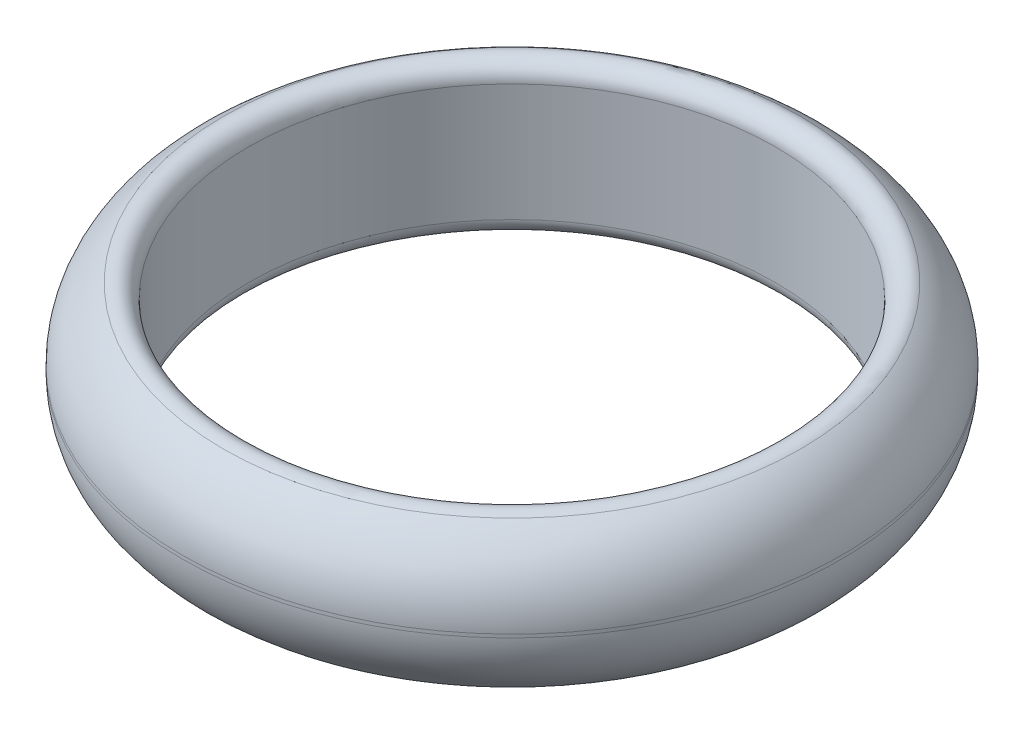
ISO-10303-21;
HEADER;
FILE_DESCRIPTION(('STEP AP214'),'2;1');
FILE_NAME('part.step','',(''),(''),'','','');
FILE_SCHEMA(('AUTOMOTIVE_DESIGN { 1 0 10303 214 1 1 1 1 }'));
ENDSEC;
DATA;
#1=APPLICATION_CONTEXT('core data for automotive mechanical design processes');
#2=APPLICATION_PROTOCOL_DEFINITION('international standard','automotive_design',2000,#1);
#3=PRODUCT_CONTEXT('',#1,'mechanical');
#4=PRODUCT('Part','Part','',(#3));
#5=PRODUCT_RELATED_PRODUCT_CATEGORY('part','',(#4));
#6=PRODUCT_DEFINITION_FORMATION('','',#4);
#7=PRODUCT_DEFINITION_CONTEXT('part definition',#1,'design');
#8=PRODUCT_DEFINITION('design','',#6,#7);
#9=PRODUCT_DEFINITION_SHAPE('','',#8);
#10=(LENGTH_UNIT() NAMED_UNIT(*) SI_UNIT(.MILLI.,.METRE.));
#11=(NAMED_UNIT(*) PLANE_ANGLE_UNIT() SI_UNIT($,.RADIAN.));
#12=(NAMED_UNIT(*) SI_UNIT($,.STERADIAN.) SOLID_ANGLE_UNIT());
#13=UNCERTAINTY_MEASURE_WITH_UNIT(LENGTH_MEASURE(1.E-05),#10,'distance_accuracy_value','');
#14=(GEOMETRIC_REPRESENTATION_CONTEXT(3) GLOBAL_UNCERTAINTY_ASSIGNED_CONTEXT((#13)) GLOBAL_UNIT_ASSIGNED_CONTEXT((#10,
#11,#12)) REPRESENTATION_CONTEXT('',''));
#15=CARTESIAN_POINT('',(0.,0.,0.));
#16=DIRECTION('',(0.,0.,1.));
#17=DIRECTION('',(1.,0.,0.));
#18=AXIS2_PLACEMENT_3D('',#15,#16,#17);
#19=CARTESIAN_POINT('',(0.,5.,0.));
#20=DIRECTION('',(0.,-1.,0.));
#21=DIRECTION('',(0.,0.,-1.));
#22=AXIS2_PLACEMENT_3D('',#19,#20,#21);
#23=CYLINDRICAL_SURFACE('',#22,10.);
#24=CARTESIAN_POINT('',(0.,2.44948974278318,0.));
#25=DIRECTION('',(0.,-1.,0.));
#26=DIRECTION('',(0.,0.,-1.));
#27=AXIS2_PLACEMENT_3D('',#24,#25,#26);
#28=CIRCLE('',#27,10.);
#29=CARTESIAN_POINT('',(0.,2.44948974278318,-10.));
#30=VERTEX_POINT('',#29);
#31=EDGE_CURVE('E51',#30,#30,#28,.F.);
#32=ORIENTED_EDGE('',*,*,#31,.T.);
#33=EDGE_LOOP('',(#32));
#34=FACE_BOUND('',#33,.T.);
#35=CARTESIAN_POINT('',(0.,2.55051025721682,0.));
#36=DIRECTION('',(0.,1.,0.));
#37=DIRECTION('',(0.,0.,1.));
#38=AXIS2_PLACEMENT_3D('',#35,#36,#37);
#39=CIRCLE('',#38,10.);
#40=CARTESIAN_POINT('',(0.,2.55051025721682,10.));
#41=VERTEX_POINT('',#40);
#42=EDGE_CURVE('E54',#41,#41,#39,.F.);
#43=ORIENTED_EDGE('',*,*,#42,.T.);
#44=EDGE_LOOP('',(#43));
#45=FACE_BOUND('',#44,.T.);
#46=ADVANCED_FACE('F31',(#34,#45),#23,.T.);
#47=CARTESIAN_POINT('',(0.,0.,0.));
#48=DIRECTION('',(0.,1.,0.));
#49=DIRECTION('',(0.,0.,1.));
#50=AXIS2_PLACEMENT_3D('',#47,#48,#49);
#51=CYLINDRICAL_SURFACE('',#50,8.);
#52=CARTESIAN_POINT('',(0.,0.717438935214209,0.));
#53=DIRECTION('',(0.,-1.,0.));
#54=DIRECTION('',(0.,0.,-1.));
#55=AXIS2_PLACEMENT_3D('',#52,#53,#54);
#56=CIRCLE('',#55,8.);
#57=CARTESIAN_POINT('',(0.,0.717438935214209,-8.));
#58=VERTEX_POINT('',#57);
#59=EDGE_CURVE('E10',#58,#58,#56,.T.);
#60=ORIENTED_EDGE('',*,*,#59,.T.);
#61=EDGE_LOOP('',(#60));
#62=FACE_BOUND('',#61,.T.);
#63=CARTESIAN_POINT('',(0.,4.28256106478579,0.));
#64=DIRECTION('',(0.,-1.,0.));
#65=DIRECTION('',(0.,0.,-1.));
#66=AXIS2_PLACEMENT_3D('',#63,#64,#65);
#67=CIRCLE('',#66,8.);
#68=CARTESIAN_POINT('',(0.,4.28256106478579,-8.));
#69=VERTEX_POINT('',#68);
#70=EDGE_CURVE('E46',#69,#69,#67,.F.);
#71=ORIENTED_EDGE('',*,*,#70,.T.);
#72=EDGE_LOOP('',(#71));
#73=FACE_BOUND('',#72,.T.);
#74=ADVANCED_FACE('F70',(#62,#73),#51,.F.);
#75=CARTESIAN_POINT('',(0.,2.44948974278318,0.));
#76=DIRECTION('',(0.,-1.,0.));
#77=DIRECTION('',(0.,0.,-1.));
#78=AXIS2_PLACEMENT_3D('',#75,#76,#77);
#79=TOROIDAL_SURFACE('',#78,7.5,2.5);
#80=CARTESIAN_POINT('',(0.,0.284426233322049,0.));
#81=DIRECTION('',(0.,1.,0.));
#82=DIRECTION('',(0.,0.,1.));
#83=AXIS2_PLACEMENT_3D('',#80,#81,#82);
#84=CIRCLE('',#83,8.74999999999991);
#85=CARTESIAN_POINT('',(0.,0.284426233322049,8.74999999999991));
#86=VERTEX_POINT('',#85);
#87=EDGE_CURVE('E38',#86,#86,#84,.T.);
#88=ORIENTED_EDGE('',*,*,#87,.T.);
#89=EDGE_LOOP('',(#88));
#90=FACE_BOUND('',#89,.T.);
#91=ORIENTED_EDGE('',*,*,#31,.F.);
#92=EDGE_LOOP('',(#91));
#93=FACE_BOUND('',#92,.T.);
#94=ADVANCED_FACE('F62',(#90,#93),#79,.T.);
#95=CARTESIAN_POINT('',(0.,2.55051025721682,0.));
#96=DIRECTION('',(0.,1.,0.));
#97=DIRECTION('',(0.,0.,1.));
#98=AXIS2_PLACEMENT_3D('',#95,#96,#97);
#99=TOROIDAL_SURFACE('',#98,7.5,2.5);
#100=CARTESIAN_POINT('',(0.,4.71557376667796,0.));
#101=DIRECTION('',(0.,-1.,0.));
#102=DIRECTION('',(0.,0.,-1.));
#103=AXIS2_PLACEMENT_3D('',#100,#101,#102);
#104=CIRCLE('',#103,8.74999999999992);
#105=CARTESIAN_POINT('',(0.,4.71557376667796,-8.74999999999992));
#106=VERTEX_POINT('',#105);
#107=EDGE_CURVE('E42',#106,#106,#104,.T.);
#108=ORIENTED_EDGE('',*,*,#107,.T.);
#109=EDGE_LOOP('',(#108));
#110=FACE_BOUND('',#109,.T.);
#111=ORIENTED_EDGE('',*,*,#42,.F.);
#112=EDGE_LOOP('',(#111));
#113=FACE_BOUND('',#112,.T.);
#114=ADVANCED_FACE('F59',(#110,#113),#99,.T.);
#115=CARTESIAN_POINT('',(0.,4.28256106478579,0.));
#116=DIRECTION('',(0.,-1.,0.));
#117=DIRECTION('',(0.,0.,-1.));
#118=AXIS2_PLACEMENT_3D('',#115,#116,#117);
#119=TOROIDAL_SURFACE('',#118,8.49999999999997,0.5);
#120=ORIENTED_EDGE('',*,*,#107,.F.);
#121=EDGE_LOOP('',(#120));
#122=FACE_BOUND('',#121,.T.);
#123=ORIENTED_EDGE('',*,*,#70,.F.);
#124=EDGE_LOOP('',(#123));
#125=FACE_BOUND('',#124,.T.);
#126=ADVANCED_FACE('F61',(#122,#125),#119,.T.);
#127=CARTESIAN_POINT('',(0.,0.717438935214209,0.));
#128=DIRECTION('',(0.,-1.,0.));
#129=DIRECTION('',(0.,0.,-1.));
#130=AXIS2_PLACEMENT_3D('',#127,#128,#129);
#131=TOROIDAL_SURFACE('',#130,8.49999999999997,0.5);
#132=ORIENTED_EDGE('',*,*,#59,.F.);
#133=EDGE_LOOP('',(#132));
#134=FACE_BOUND('',#133,.T.);
#135=ORIENTED_EDGE('',*,*,#87,.F.);
#136=EDGE_LOOP('',(#135));
#137=FACE_BOUND('',#136,.T.);
#138=ADVANCED_FACE('F33',(#134,#137),#131,.T.);
#139=CLOSED_SHELL('',(#46,#74,#94,#114,#126,#138));
#140=MANIFOLD_SOLID_BREP('B2',#139);
#141=ADVANCED_BREP_SHAPE_REPRESENTATION('',(#18,#140),#14);
#142=SHAPE_DEFINITION_REPRESENTATION(#9,#141);
ENDSEC;
END-ISO-10303-21;
